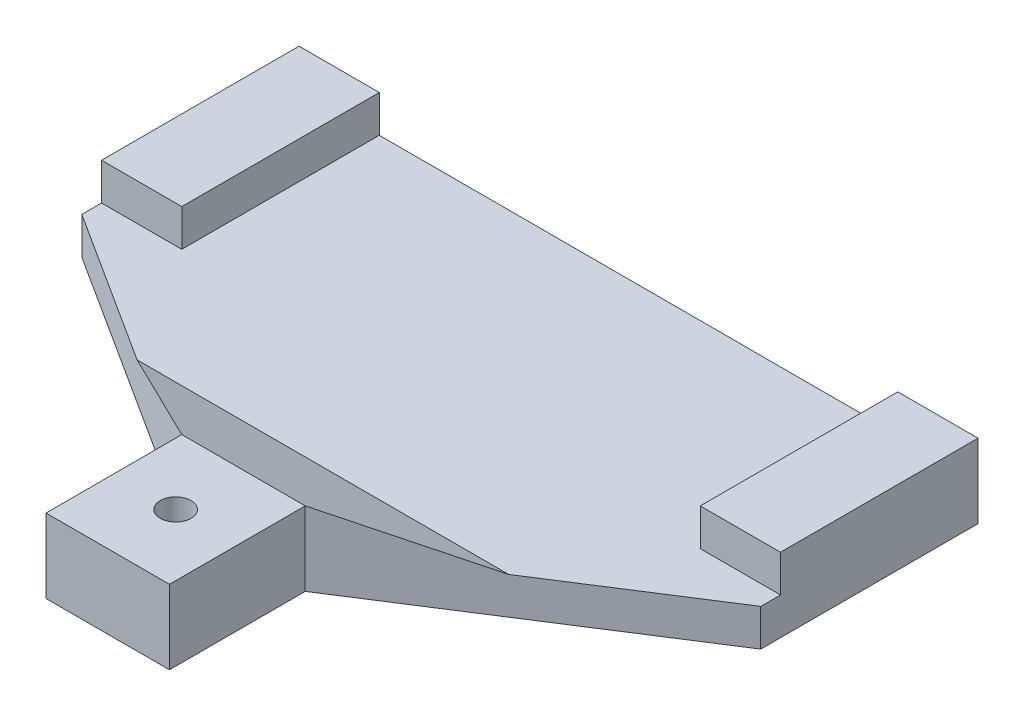
ISO-10303-21;
HEADER;
FILE_DESCRIPTION(('STEP AP214'),'2;1');
FILE_NAME('part.step','',(''),(''),'','','');
FILE_SCHEMA(('AUTOMOTIVE_DESIGN { 1 0 10303 214 1 1 1 1 }'));
ENDSEC;
DATA;
#1=APPLICATION_CONTEXT('core data for automotive mechanical design processes');
#2=APPLICATION_PROTOCOL_DEFINITION('international standard','automotive_design',2000,#1);
#3=PRODUCT_CONTEXT('',#1,'mechanical');
#4=PRODUCT('Part','Part','',(#3));
#5=PRODUCT_RELATED_PRODUCT_CATEGORY('part','',(#4));
#6=PRODUCT_DEFINITION_FORMATION('','',#4);
#7=PRODUCT_DEFINITION_CONTEXT('part definition',#1,'design');
#8=PRODUCT_DEFINITION('design','',#6,#7);
#9=PRODUCT_DEFINITION_SHAPE('','',#8);
#10=(LENGTH_UNIT() NAMED_UNIT(*) SI_UNIT(.MILLI.,.METRE.));
#11=(NAMED_UNIT(*) PLANE_ANGLE_UNIT() SI_UNIT($,.RADIAN.));
#12=(NAMED_UNIT(*) SI_UNIT($,.STERADIAN.) SOLID_ANGLE_UNIT());
#13=UNCERTAINTY_MEASURE_WITH_UNIT(LENGTH_MEASURE(1.E-05),#10,'distance_accuracy_value','');
#14=(GEOMETRIC_REPRESENTATION_CONTEXT(3) GLOBAL_UNCERTAINTY_ASSIGNED_CONTEXT((#13)) GLOBAL_UNIT_ASSIGNED_CONTEXT((#10,
#11,#12)) REPRESENTATION_CONTEXT('',''));
#15=CARTESIAN_POINT('',(0.,0.,0.));
#16=DIRECTION('',(0.,0.,1.));
#17=DIRECTION('',(1.,0.,0.));
#18=AXIS2_PLACEMENT_3D('',#15,#16,#17);
#19=CARTESIAN_POINT('',(0.,6.,60.));
#20=DIRECTION('',(0.,-1.,0.));
#21=DIRECTION('',(0.,0.,-1.));
#22=AXIS2_PLACEMENT_3D('',#19,#20,#21);
#23=PLANE('',#22);
#24=DIRECTION('',(-1.,0.,0.));
#25=VECTOR('',#24,1.);
#26=CARTESIAN_POINT('',(0.,6.,0.));
#27=LINE('',#26,#25);
#28=CARTESIAN_POINT('',(9.,6.,0.));
#29=VERTEX_POINT('',#28);
#30=CARTESIAN_POINT('',(2.5,6.,0.));
#31=VERTEX_POINT('',#30);
#32=EDGE_CURVE('E154',#29,#31,#27,.T.);
#33=ORIENTED_EDGE('',*,*,#32,.T.);
#34=DIRECTION('',(0.,0.,-1.));
#35=VECTOR('',#34,1.);
#36=CARTESIAN_POINT('',(2.5,6.,40.));
#37=LINE('',#36,#35);
#38=CARTESIAN_POINT('',(2.5,6.,16.));
#39=VERTEX_POINT('',#38);
#40=EDGE_CURVE('E137',#39,#31,#37,.T.);
#41=ORIENTED_EDGE('',*,*,#40,.F.);
#42=DIRECTION('',(-1.,0.,0.));
#43=VECTOR('',#42,1.);
#44=CARTESIAN_POINT('',(0.,6.,16.));
#45=LINE('',#44,#43);
#46=CARTESIAN_POINT('',(9.,6.,16.));
#47=VERTEX_POINT('',#46);
#48=EDGE_CURVE('E237',#47,#39,#45,.T.);
#49=ORIENTED_EDGE('',*,*,#48,.F.);
#50=DIRECTION('',(0.,0.,1.));
#51=VECTOR('',#50,1.);
#52=CARTESIAN_POINT('',(9.,6.,16.));
#53=LINE('',#52,#51);
#54=EDGE_CURVE('E160',#29,#47,#53,.T.);
#55=ORIENTED_EDGE('',*,*,#54,.F.);
#56=EDGE_LOOP('',(#33,#41,#49,#55));
#57=FACE_BOUND('',#56,.T.);
#58=ADVANCED_FACE('F33',(#57),#23,.F.);
#59=CARTESIAN_POINT('',(30.,6.,37.5));
#60=DIRECTION('',(0.,1.,0.));
#61=DIRECTION('',(0.,0.,1.));
#62=AXIS2_PLACEMENT_3D('',#59,#60,#61);
#63=CIRCLE('',#62,1.25);
#64=CARTESIAN_POINT('',(30.,6.,38.75));
#65=VERTEX_POINT('',#64);
#66=EDGE_CURVE('E256',#65,#65,#63,.T.);
#67=ORIENTED_EDGE('',*,*,#66,.F.);
#68=EDGE_LOOP('',(#67));
#69=FACE_BOUND('',#68,.T.);
#70=DIRECTION('',(0.,0.,1.));
#71=VECTOR('',#70,1.);
#72=CARTESIAN_POINT('',(25.,6.,32.));
#73=LINE('',#72,#71);
#74=CARTESIAN_POINT('',(25.,5.99999999999999,32.));
#75=VERTEX_POINT('',#74);
#76=CARTESIAN_POINT('',(25.,6.,43.));
#77=VERTEX_POINT('',#76);
#78=EDGE_CURVE('E216',#75,#77,#73,.T.);
#79=ORIENTED_EDGE('',*,*,#78,.T.);
#80=DIRECTION('',(1.,0.,0.));
#81=VECTOR('',#80,1.);
#82=CARTESIAN_POINT('',(25.,6.,43.));
#83=LINE('',#82,#81);
#84=CARTESIAN_POINT('',(35.,6.,43.));
#85=VERTEX_POINT('',#84);
#86=EDGE_CURVE('E219',#77,#85,#83,.T.);
#87=ORIENTED_EDGE('',*,*,#86,.T.);
#88=DIRECTION('',(0.,0.,-1.));
#89=VECTOR('',#88,1.);
#90=CARTESIAN_POINT('',(35.,6.,43.));
#91=LINE('',#90,#89);
#92=CARTESIAN_POINT('',(35.,6.,32.));
#93=VERTEX_POINT('',#92);
#94=EDGE_CURVE('E222',#85,#93,#91,.T.);
#95=ORIENTED_EDGE('',*,*,#94,.T.);
#96=DIRECTION('',(-1.,0.,0.));
#97=VECTOR('',#96,1.);
#98=CARTESIAN_POINT('',(35.,6.,32.));
#99=LINE('',#98,#97);
#100=EDGE_CURVE('E225',#93,#75,#99,.T.);
#101=ORIENTED_EDGE('',*,*,#100,.T.);
#102=EDGE_LOOP('',(#79,#87,#95,#101));
#103=FACE_BOUND('',#102,.T.);
#104=ADVANCED_FACE('F295',(#69,#103),#23,.F.);
#105=CARTESIAN_POINT('',(0.,0.,60.));
#106=DIRECTION('',(0.,1.,0.));
#107=DIRECTION('',(0.,0.,1.));
#108=AXIS2_PLACEMENT_3D('',#105,#106,#107);
#109=PLANE('',#108);
#110=CARTESIAN_POINT('',(30.,0.,37.5));
#111=DIRECTION('',(0.,1.,0.));
#112=DIRECTION('',(0.,0.,1.));
#113=AXIS2_PLACEMENT_3D('',#110,#111,#112);
#114=CIRCLE('',#113,1.25);
#115=CARTESIAN_POINT('',(30.,0.,38.75));
#116=VERTEX_POINT('',#115);
#117=EDGE_CURVE('E266',#116,#116,#114,.T.);
#118=ORIENTED_EDGE('',*,*,#117,.T.);
#119=EDGE_LOOP('',(#118));
#120=FACE_BOUND('',#119,.T.);
#121=DIRECTION('',(-0.842271400661512,0.,-0.539053696423367));
#122=VECTOR('',#121,1.);
#123=CARTESIAN_POINT('',(19.9772985244041,0.,28.7854710556186));
#124=LINE('',#123,#122);
#125=CARTESIAN_POINT('',(25.,0.,32.));
#126=VERTEX_POINT('',#125);
#127=CARTESIAN_POINT('',(2.5,0.,17.6));
#128=VERTEX_POINT('',#127);
#129=EDGE_CURVE('E213',#126,#128,#124,.T.);
#130=ORIENTED_EDGE('',*,*,#129,.T.);
#131=DIRECTION('',(0.,0.,-1.));
#132=VECTOR('',#131,1.);
#133=CARTESIAN_POINT('',(2.5,0.,40.));
#134=LINE('',#133,#132);
#135=CARTESIAN_POINT('',(2.5,0.,0.));
#136=VERTEX_POINT('',#135);
#137=EDGE_CURVE('E48',#128,#136,#134,.T.);
#138=ORIENTED_EDGE('',*,*,#137,.T.);
#139=DIRECTION('',(1.,0.,0.));
#140=VECTOR('',#139,1.);
#141=CARTESIAN_POINT('',(0.,0.,0.));
#142=LINE('',#141,#140);
#143=CARTESIAN_POINT('',(57.5,0.,0.));
#144=VERTEX_POINT('',#143);
#145=EDGE_CURVE('E156',#136,#144,#142,.T.);
#146=ORIENTED_EDGE('',*,*,#145,.T.);
#147=DIRECTION('',(0.,0.,-1.));
#148=VECTOR('',#147,1.);
#149=CARTESIAN_POINT('',(57.5,0.,40.));
#150=LINE('',#149,#148);
#151=CARTESIAN_POINT('',(57.5,0.,17.6));
#152=VERTEX_POINT('',#151);
#153=EDGE_CURVE('E328',#152,#144,#150,.T.);
#154=ORIENTED_EDGE('',*,*,#153,.F.);
#155=DIRECTION('',(-0.842271400661512,0.,0.539053696423367));
#156=VECTOR('',#155,1.);
#157=CARTESIAN_POINT('',(-2.54256526674234,0.,56.0272417707151));
#158=LINE('',#157,#156);
#159=CARTESIAN_POINT('',(35.,0.,32.));
#160=VERTEX_POINT('',#159);
#161=EDGE_CURVE('E180',#152,#160,#158,.T.);
#162=ORIENTED_EDGE('',*,*,#161,.T.);
#163=DIRECTION('',(0.,0.,1.));
#164=VECTOR('',#163,1.);
#165=CARTESIAN_POINT('',(35.,0.,60.));
#166=LINE('',#165,#164);
#167=CARTESIAN_POINT('',(35.,0.,43.));
#168=VERTEX_POINT('',#167);
#169=EDGE_CURVE('E204',#160,#168,#166,.T.);
#170=ORIENTED_EDGE('',*,*,#169,.T.);
#171=DIRECTION('',(-1.,0.,0.));
#172=VECTOR('',#171,1.);
#173=CARTESIAN_POINT('',(0.,0.,43.));
#174=LINE('',#173,#172);
#175=CARTESIAN_POINT('',(25.,0.,43.));
#176=VERTEX_POINT('',#175);
#177=EDGE_CURVE('E207',#168,#176,#174,.T.);
#178=ORIENTED_EDGE('',*,*,#177,.T.);
#179=DIRECTION('',(0.,0.,-1.));
#180=VECTOR('',#179,1.);
#181=CARTESIAN_POINT('',(25.,0.,60.));
#182=LINE('',#181,#180);
#183=EDGE_CURVE('E210',#176,#126,#182,.T.);
#184=ORIENTED_EDGE('',*,*,#183,.T.);
#185=EDGE_LOOP('',(#130,#138,#146,#154,#162,#170,#178,#184));
#186=FACE_BOUND('',#185,.T.);
#187=ADVANCED_FACE('F292',(#120,#186),#109,.F.);
#188=DIRECTION('',(-1.,0.,0.));
#189=VECTOR('',#188,1.);
#190=CARTESIAN_POINT('',(51.,6.,16.));
#191=LINE('',#190,#189);
#192=CARTESIAN_POINT('',(57.5,6.,16.));
#193=VERTEX_POINT('',#192);
#194=CARTESIAN_POINT('',(51.,6.,16.));
#195=VERTEX_POINT('',#194);
#196=EDGE_CURVE('E232',#193,#195,#191,.T.);
#197=ORIENTED_EDGE('',*,*,#196,.F.);
#198=DIRECTION('',(0.,0.,-1.));
#199=VECTOR('',#198,1.);
#200=CARTESIAN_POINT('',(57.5,6.,40.));
#201=LINE('',#200,#199);
#202=CARTESIAN_POINT('',(57.5,6.,0.));
#203=VERTEX_POINT('',#202);
#204=EDGE_CURVE('E329',#193,#203,#201,.T.);
#205=ORIENTED_EDGE('',*,*,#204,.T.);
#206=CARTESIAN_POINT('',(51.,6.,0.));
#207=VERTEX_POINT('',#206);
#208=EDGE_CURVE('E161',#203,#207,#27,.T.);
#209=ORIENTED_EDGE('',*,*,#208,.T.);
#210=DIRECTION('',(0.,0.,-1.));
#211=VECTOR('',#210,1.);
#212=CARTESIAN_POINT('',(51.,6.,0.));
#213=LINE('',#212,#211);
#214=EDGE_CURVE('E249',#195,#207,#213,.T.);
#215=ORIENTED_EDGE('',*,*,#214,.F.);
#216=EDGE_LOOP('',(#197,#205,#209,#215));
#217=FACE_BOUND('',#216,.T.);
#218=ADVANCED_FACE('F283',(#217),#23,.F.);
#219=CARTESIAN_POINT('',(0.,0.,0.));
#220=DIRECTION('',(0.,0.,-1.));
#221=DIRECTION('',(-1.,0.,0.));
#222=AXIS2_PLACEMENT_3D('',#219,#220,#221);
#223=PLANE('',#222);
#224=DIRECTION('',(0.,-1.,0.));
#225=VECTOR('',#224,1.);
#226=CARTESIAN_POINT('',(2.5,0.,0.));
#227=LINE('',#226,#225);
#228=EDGE_CURVE('E140',#31,#136,#227,.T.);
#229=ORIENTED_EDGE('',*,*,#228,.F.);
#230=ORIENTED_EDGE('',*,*,#32,.F.);
#231=DIRECTION('',(0.,1.,0.));
#232=VECTOR('',#231,1.);
#233=CARTESIAN_POINT('',(9.,3.,0.));
#234=LINE('',#233,#232);
#235=CARTESIAN_POINT('',(9.,3.,0.));
#236=VERTEX_POINT('',#235);
#237=EDGE_CURVE('E257',#236,#29,#234,.T.);
#238=ORIENTED_EDGE('',*,*,#237,.F.);
#239=DIRECTION('',(-1.,0.,0.));
#240=VECTOR('',#239,1.);
#241=CARTESIAN_POINT('',(9.,3.,0.));
#242=LINE('',#241,#240);
#243=CARTESIAN_POINT('',(51.,3.,0.));
#244=VERTEX_POINT('',#243);
#245=EDGE_CURVE('E239',#244,#236,#242,.T.);
#246=ORIENTED_EDGE('',*,*,#245,.F.);
#247=DIRECTION('',(0.,1.,0.));
#248=VECTOR('',#247,1.);
#249=CARTESIAN_POINT('',(51.,3.,0.));
#250=LINE('',#249,#248);
#251=EDGE_CURVE('E259',#244,#207,#250,.T.);
#252=ORIENTED_EDGE('',*,*,#251,.T.);
#253=ORIENTED_EDGE('',*,*,#208,.F.);
#254=DIRECTION('',(0.,1.,0.));
#255=VECTOR('',#254,1.);
#256=CARTESIAN_POINT('',(57.5,6.,0.));
#257=LINE('',#256,#255);
#258=EDGE_CURVE('E323',#144,#203,#257,.T.);
#259=ORIENTED_EDGE('',*,*,#258,.F.);
#260=ORIENTED_EDGE('',*,*,#145,.F.);
#261=EDGE_LOOP('',(#229,#230,#238,#246,#252,#253,#259,#260));
#262=FACE_BOUND('',#261,.T.);
#263=CARTESIAN_POINT('',(5.75,3.,0.));
#264=DIRECTION('',(0.,0.,-1.));
#265=DIRECTION('',(-1.,0.,0.));
#266=AXIS2_PLACEMENT_3D('',#263,#264,#265);
#267=CIRCLE('',#266,1.25);
#268=CARTESIAN_POINT('',(4.5,3.,0.));
#269=VERTEX_POINT('',#268);
#270=EDGE_CURVE('E269',#269,#269,#267,.T.);
#271=ORIENTED_EDGE('',*,*,#270,.F.);
#272=EDGE_LOOP('',(#271));
#273=FACE_BOUND('',#272,.T.);
#274=CARTESIAN_POINT('',(54.,3.,0.));
#275=DIRECTION('',(0.,0.,-1.));
#276=DIRECTION('',(-1.,0.,0.));
#277=AXIS2_PLACEMENT_3D('',#274,#275,#276);
#278=CIRCLE('',#277,1.25);
#279=CARTESIAN_POINT('',(52.75,3.,0.));
#280=VERTEX_POINT('',#279);
#281=EDGE_CURVE('E273',#280,#280,#278,.T.);
#282=ORIENTED_EDGE('',*,*,#281,.F.);
#283=EDGE_LOOP('',(#282));
#284=FACE_BOUND('',#283,.T.);
#285=ADVANCED_FACE('F151',(#262,#273,#284),#223,.T.);
#286=CARTESIAN_POINT('',(54.,3.,15.));
#287=DIRECTION('',(0.,0.,-1.));
#288=DIRECTION('',(-1.,0.,0.));
#289=AXIS2_PLACEMENT_3D('',#286,#287,#288);
#290=CYLINDRICAL_SURFACE('',#289,1.25);
#291=CARTESIAN_POINT('',(54.,3.,15.));
#292=DIRECTION('',(0.,0.,-1.));
#293=DIRECTION('',(-1.,0.,0.));
#294=AXIS2_PLACEMENT_3D('',#291,#292,#293);
#295=CIRCLE('',#294,1.25);
#296=CARTESIAN_POINT('',(52.75,3.,15.));
#297=VERTEX_POINT('',#296);
#298=EDGE_CURVE('E164',#297,#297,#295,.T.);
#299=ORIENTED_EDGE('',*,*,#298,.F.);
#300=EDGE_LOOP('',(#299));
#301=FACE_BOUND('',#300,.T.);
#302=ORIENTED_EDGE('',*,*,#281,.T.);
#303=EDGE_LOOP('',(#302));
#304=FACE_BOUND('',#303,.T.);
#305=ADVANCED_FACE('F280',(#301,#304),#290,.F.);
#306=CARTESIAN_POINT('',(54.,3.,15.));
#307=DIRECTION('',(0.,0.,-1.));
#308=DIRECTION('',(-1.,0.,0.));
#309=AXIS2_PLACEMENT_3D('',#306,#307,#308);
#310=PLANE('',#309);
#311=ORIENTED_EDGE('',*,*,#298,.T.);
#312=EDGE_LOOP('',(#311));
#313=FACE_BOUND('',#312,.T.);
#314=ADVANCED_FACE('F289',(#313),#310,.T.);
#315=CARTESIAN_POINT('',(5.75,3.,15.));
#316=DIRECTION('',(0.,0.,-1.));
#317=DIRECTION('',(-1.,0.,0.));
#318=AXIS2_PLACEMENT_3D('',#315,#316,#317);
#319=CYLINDRICAL_SURFACE('',#318,1.25);
#320=CARTESIAN_POINT('',(5.75,3.,15.));
#321=DIRECTION('',(0.,0.,-1.));
#322=DIRECTION('',(-1.,0.,0.));
#323=AXIS2_PLACEMENT_3D('',#320,#321,#322);
#324=CIRCLE('',#323,1.25);
#325=CARTESIAN_POINT('',(4.5,3.,15.));
#326=VERTEX_POINT('',#325);
#327=EDGE_CURVE('E270',#326,#326,#324,.T.);
#328=ORIENTED_EDGE('',*,*,#327,.F.);
#329=EDGE_LOOP('',(#328));
#330=FACE_BOUND('',#329,.T.);
#331=ORIENTED_EDGE('',*,*,#270,.T.);
#332=EDGE_LOOP('',(#331));
#333=FACE_BOUND('',#332,.T.);
#334=ADVANCED_FACE('F368',(#330,#333),#319,.F.);
#335=CARTESIAN_POINT('',(5.75,3.,15.));
#336=DIRECTION('',(0.,0.,-1.));
#337=DIRECTION('',(-1.,0.,0.));
#338=AXIS2_PLACEMENT_3D('',#335,#336,#337);
#339=PLANE('',#338);
#340=ORIENTED_EDGE('',*,*,#327,.T.);
#341=EDGE_LOOP('',(#340));
#342=FACE_BOUND('',#341,.T.);
#343=ADVANCED_FACE('F356',(#342),#339,.T.);
#344=CARTESIAN_POINT('',(30.,-9.,37.5));
#345=DIRECTION('',(0.,1.,0.));
#346=DIRECTION('',(0.,0.,1.));
#347=AXIS2_PLACEMENT_3D('',#344,#345,#346);
#348=CYLINDRICAL_SURFACE('',#347,1.25);
#349=ORIENTED_EDGE('',*,*,#66,.T.);
#350=EDGE_LOOP('',(#349));
#351=FACE_BOUND('',#350,.T.);
#352=ORIENTED_EDGE('',*,*,#117,.F.);
#353=EDGE_LOOP('',(#352));
#354=FACE_BOUND('',#353,.T.);
#355=ADVANCED_FACE('F349',(#351,#354),#348,.F.);
#356=CARTESIAN_POINT('',(0.,3.,16.));
#357=DIRECTION('',(0.,0.,-1.));
#358=DIRECTION('',(-1.,0.,0.));
#359=AXIS2_PLACEMENT_3D('',#356,#357,#358);
#360=PLANE('',#359);
#361=ORIENTED_EDGE('',*,*,#48,.T.);
#362=DIRECTION('',(0.,-1.,0.));
#363=VECTOR('',#362,1.);
#364=CARTESIAN_POINT('',(2.5,3.,16.));
#365=LINE('',#364,#363);
#366=CARTESIAN_POINT('',(2.5,3.,16.));
#367=VERTEX_POINT('',#366);
#368=EDGE_CURVE('E142',#39,#367,#365,.T.);
#369=ORIENTED_EDGE('',*,*,#368,.T.);
#370=DIRECTION('',(-1.,0.,0.));
#371=VECTOR('',#370,1.);
#372=CARTESIAN_POINT('',(0.,3.,16.));
#373=LINE('',#372,#371);
#374=CARTESIAN_POINT('',(9.,3.,16.));
#375=VERTEX_POINT('',#374);
#376=EDGE_CURVE('E245',#375,#367,#373,.T.);
#377=ORIENTED_EDGE('',*,*,#376,.F.);
#378=DIRECTION('',(0.,1.,0.));
#379=VECTOR('',#378,1.);
#380=CARTESIAN_POINT('',(9.,3.,16.));
#381=LINE('',#380,#379);
#382=EDGE_CURVE('E254',#375,#47,#381,.T.);
#383=ORIENTED_EDGE('',*,*,#382,.T.);
#384=EDGE_LOOP('',(#361,#369,#377,#383));
#385=FACE_BOUND('',#384,.T.);
#386=ADVANCED_FACE('F347',(#385),#360,.F.);
#387=CARTESIAN_POINT('',(9.,3.,16.));
#388=DIRECTION('',(-1.,0.,0.));
#389=DIRECTION('',(0.,0.,1.));
#390=AXIS2_PLACEMENT_3D('',#387,#388,#389);
#391=PLANE('',#390);
#392=ORIENTED_EDGE('',*,*,#54,.T.);
#393=ORIENTED_EDGE('',*,*,#382,.F.);
#394=DIRECTION('',(0.,0.,1.));
#395=VECTOR('',#394,1.);
#396=CARTESIAN_POINT('',(9.,3.,16.));
#397=LINE('',#396,#395);
#398=EDGE_CURVE('E242',#236,#375,#397,.T.);
#399=ORIENTED_EDGE('',*,*,#398,.F.);
#400=ORIENTED_EDGE('',*,*,#237,.T.);
#401=EDGE_LOOP('',(#392,#393,#399,#400));
#402=FACE_BOUND('',#401,.T.);
#403=ADVANCED_FACE('F345',(#402),#391,.F.);
#404=CARTESIAN_POINT('',(51.,3.,0.));
#405=DIRECTION('',(1.,0.,0.));
#406=DIRECTION('',(0.,0.,-1.));
#407=AXIS2_PLACEMENT_3D('',#404,#405,#406);
#408=PLANE('',#407);
#409=ORIENTED_EDGE('',*,*,#214,.T.);
#410=ORIENTED_EDGE('',*,*,#251,.F.);
#411=DIRECTION('',(0.,0.,-1.));
#412=VECTOR('',#411,1.);
#413=CARTESIAN_POINT('',(51.,3.,0.));
#414=LINE('',#413,#412);
#415=CARTESIAN_POINT('',(51.,3.,16.));
#416=VERTEX_POINT('',#415);
#417=EDGE_CURVE('E236',#416,#244,#414,.T.);
#418=ORIENTED_EDGE('',*,*,#417,.F.);
#419=DIRECTION('',(0.,1.,0.));
#420=VECTOR('',#419,1.);
#421=CARTESIAN_POINT('',(51.,3.,16.));
#422=LINE('',#421,#420);
#423=EDGE_CURVE('E247',#416,#195,#422,.T.);
#424=ORIENTED_EDGE('',*,*,#423,.T.);
#425=EDGE_LOOP('',(#409,#410,#418,#424));
#426=FACE_BOUND('',#425,.T.);
#427=ADVANCED_FACE('F339',(#426),#408,.F.);
#428=CARTESIAN_POINT('',(51.,3.,16.));
#429=DIRECTION('',(0.,0.,-1.));
#430=DIRECTION('',(-1.,0.,0.));
#431=AXIS2_PLACEMENT_3D('',#428,#429,#430);
#432=PLANE('',#431);
#433=DIRECTION('',(-1.,0.,0.));
#434=VECTOR('',#433,1.);
#435=CARTESIAN_POINT('',(51.,3.,16.));
#436=LINE('',#435,#434);
#437=CARTESIAN_POINT('',(57.5,3.,16.));
#438=VERTEX_POINT('',#437);
#439=EDGE_CURVE('E234',#438,#416,#436,.T.);
#440=ORIENTED_EDGE('',*,*,#439,.F.);
#441=DIRECTION('',(0.,1.,0.));
#442=VECTOR('',#441,1.);
#443=CARTESIAN_POINT('',(57.5,3.,16.));
#444=LINE('',#443,#442);
#445=EDGE_CURVE('E191',#438,#193,#444,.T.);
#446=ORIENTED_EDGE('',*,*,#445,.T.);
#447=ORIENTED_EDGE('',*,*,#196,.T.);
#448=ORIENTED_EDGE('',*,*,#423,.F.);
#449=EDGE_LOOP('',(#440,#446,#447,#448));
#450=FACE_BOUND('',#449,.T.);
#451=ADVANCED_FACE('F343',(#450),#432,.F.);
#452=CARTESIAN_POINT('',(0.,3.,0.));
#453=DIRECTION('',(0.,-1.,0.));
#454=DIRECTION('',(0.,0.,-1.));
#455=AXIS2_PLACEMENT_3D('',#452,#453,#454);
#456=PLANE('',#455);
#457=ORIENTED_EDGE('',*,*,#376,.T.);
#458=DIRECTION('',(0.,0.,1.));
#459=VECTOR('',#458,1.);
#460=CARTESIAN_POINT('',(2.5,3.,0.));
#461=LINE('',#460,#459);
#462=CARTESIAN_POINT('',(2.5,3.,17.6));
#463=VERTEX_POINT('',#462);
#464=EDGE_CURVE('E320',#367,#463,#461,.T.);
#465=ORIENTED_EDGE('',*,*,#464,.T.);
#466=DIRECTION('',(-0.842271400661512,0.,-0.539053696423367));
#467=VECTOR('',#466,1.);
#468=CARTESIAN_POINT('',(25.,3.,32.));
#469=LINE('',#468,#467);
#470=CARTESIAN_POINT('',(14.9476238101113,3.,25.5664792384712));
#471=VERTEX_POINT('',#470);
#472=EDGE_CURVE('E190',#471,#463,#469,.T.);
#473=ORIENTED_EDGE('',*,*,#472,.F.);
#474=DIRECTION('',(1.,0.,0.));
#475=VECTOR('',#474,1.);
#476=CARTESIAN_POINT('',(0.,3.,25.5664792384712));
#477=LINE('',#476,#475);
#478=CARTESIAN_POINT('',(45.0523761898887,3.,25.5664792384712));
#479=VERTEX_POINT('',#478);
#480=EDGE_CURVE('E163',#471,#479,#477,.T.);
#481=ORIENTED_EDGE('',*,*,#480,.T.);
#482=DIRECTION('',(-0.842271400661512,0.,0.539053696423367));
#483=VECTOR('',#482,1.);
#484=CARTESIAN_POINT('',(60.,3.,16.));
#485=LINE('',#484,#483);
#486=CARTESIAN_POINT('',(57.5,3.,17.6));
#487=VERTEX_POINT('',#486);
#488=EDGE_CURVE('E178',#487,#479,#485,.T.);
#489=ORIENTED_EDGE('',*,*,#488,.F.);
#490=DIRECTION('',(0.,0.,-1.));
#491=VECTOR('',#490,1.);
#492=CARTESIAN_POINT('',(57.5,3.,0.));
#493=LINE('',#492,#491);
#494=EDGE_CURVE('E55',#487,#438,#493,.T.);
#495=ORIENTED_EDGE('',*,*,#494,.T.);
#496=ORIENTED_EDGE('',*,*,#439,.T.);
#497=ORIENTED_EDGE('',*,*,#417,.T.);
#498=ORIENTED_EDGE('',*,*,#245,.T.);
#499=ORIENTED_EDGE('',*,*,#398,.T.);
#500=EDGE_LOOP('',(#457,#465,#473,#481,#489,#495,#496,#497,#498,#499));
#501=FACE_BOUND('',#500,.T.);
#502=ADVANCED_FACE('F185',(#501),#456,.F.);
#503=CARTESIAN_POINT('',(25.,3.,32.));
#504=DIRECTION('',(-1.,0.,0.));
#505=DIRECTION('',(0.,0.,1.));
#506=AXIS2_PLACEMENT_3D('',#503,#504,#505);
#507=PLANE('',#506);
#508=ORIENTED_EDGE('',*,*,#78,.F.);
#509=DIRECTION('',(0.,1.,0.));
#510=VECTOR('',#509,1.);
#511=CARTESIAN_POINT('',(25.,-49.,32.));
#512=LINE('',#511,#510);
#513=EDGE_CURVE('E200',#126,#75,#512,.T.);
#514=ORIENTED_EDGE('',*,*,#513,.F.);
#515=ORIENTED_EDGE('',*,*,#183,.F.);
#516=DIRECTION('',(0.,1.,0.));
#517=VECTOR('',#516,1.);
#518=CARTESIAN_POINT('',(25.,3.,43.));
#519=LINE('',#518,#517);
#520=EDGE_CURVE('E228',#176,#77,#519,.T.);
#521=ORIENTED_EDGE('',*,*,#520,.T.);
#522=EDGE_LOOP('',(#508,#514,#515,#521));
#523=FACE_BOUND('',#522,.T.);
#524=ADVANCED_FACE('F314',(#523),#507,.T.);
#525=CARTESIAN_POINT('',(35.,3.,43.));
#526=DIRECTION('',(1.,0.,0.));
#527=DIRECTION('',(0.,0.,-1.));
#528=AXIS2_PLACEMENT_3D('',#525,#526,#527);
#529=PLANE('',#528);
#530=ORIENTED_EDGE('',*,*,#94,.F.);
#531=DIRECTION('',(0.,1.,0.));
#532=VECTOR('',#531,1.);
#533=CARTESIAN_POINT('',(35.,3.,43.));
#534=LINE('',#533,#532);
#535=EDGE_CURVE('E229',#168,#85,#534,.T.);
#536=ORIENTED_EDGE('',*,*,#535,.F.);
#537=ORIENTED_EDGE('',*,*,#169,.F.);
#538=DIRECTION('',(0.,1.,0.));
#539=VECTOR('',#538,1.);
#540=CARTESIAN_POINT('',(35.,-49.,32.));
#541=LINE('',#540,#539);
#542=EDGE_CURVE('E194',#160,#93,#541,.T.);
#543=ORIENTED_EDGE('',*,*,#542,.T.);
#544=EDGE_LOOP('',(#530,#536,#537,#543));
#545=FACE_BOUND('',#544,.T.);
#546=ADVANCED_FACE('F417',(#545),#529,.T.);
#547=CARTESIAN_POINT('',(25.,3.,43.));
#548=DIRECTION('',(0.,0.,1.));
#549=DIRECTION('',(1.,0.,0.));
#550=AXIS2_PLACEMENT_3D('',#547,#548,#549);
#551=PLANE('',#550);
#552=ORIENTED_EDGE('',*,*,#86,.F.);
#553=ORIENTED_EDGE('',*,*,#520,.F.);
#554=ORIENTED_EDGE('',*,*,#177,.F.);
#555=ORIENTED_EDGE('',*,*,#535,.T.);
#556=EDGE_LOOP('',(#552,#553,#554,#555));
#557=FACE_BOUND('',#556,.T.);
#558=ADVANCED_FACE('F412',(#557),#551,.T.);
#559=CARTESIAN_POINT('',(25.,-49.,32.));
#560=DIRECTION('',(0.539053696423367,0.,-0.842271400661512));
#561=DIRECTION('',(-0.842271400661512,0.,-0.539053696423367));
#562=AXIS2_PLACEMENT_3D('',#559,#560,#561);
#563=PLANE('',#562);
#564=ORIENTED_EDGE('',*,*,#472,.T.);
#565=DIRECTION('',(0.,-1.,0.));
#566=VECTOR('',#565,1.);
#567=CARTESIAN_POINT('',(2.5,-49.,17.6));
#568=LINE('',#567,#566);
#569=EDGE_CURVE('E11',#463,#128,#568,.T.);
#570=ORIENTED_EDGE('',*,*,#569,.T.);
#571=ORIENTED_EDGE('',*,*,#129,.F.);
#572=ORIENTED_EDGE('',*,*,#513,.T.);
#573=DIRECTION('',(-0.816860277986021,-0.243781250091197,-0.522790577911053));
#574=VECTOR('',#573,1.);
#575=CARTESIAN_POINT('',(14.0475629155499,2.73138861571853,24.9904402659519));
#576=LINE('',#575,#574);
#577=EDGE_CURVE('E170',#75,#471,#576,.T.);
#578=ORIENTED_EDGE('',*,*,#577,.T.);
#579=EDGE_LOOP('',(#564,#570,#571,#572,#578));
#580=FACE_BOUND('',#579,.T.);
#581=ADVANCED_FACE('F310',(#580),#563,.F.);
#582=CARTESIAN_POINT('',(60.,-49.,16.));
#583=DIRECTION('',(-0.539053696423367,0.,-0.842271400661512));
#584=DIRECTION('',(-0.842271400661512,0.,0.539053696423367));
#585=AXIS2_PLACEMENT_3D('',#582,#583,#584);
#586=PLANE('',#585);
#587=ORIENTED_EDGE('',*,*,#161,.F.);
#588=DIRECTION('',(0.,1.,0.));
#589=VECTOR('',#588,1.);
#590=CARTESIAN_POINT('',(57.5,-49.,17.6));
#591=LINE('',#590,#589);
#592=EDGE_CURVE('E41',#152,#487,#591,.T.);
#593=ORIENTED_EDGE('',*,*,#592,.T.);
#594=ORIENTED_EDGE('',*,*,#488,.T.);
#595=DIRECTION('',(-0.816860277986021,0.243781250091197,0.522790577911053));
#596=VECTOR('',#595,1.);
#597=CARTESIAN_POINT('',(69.4667046370494,-4.28613652711823,9.94130903228836));
#598=LINE('',#597,#596);
#599=EDGE_CURVE('E172',#479,#93,#598,.T.);
#600=ORIENTED_EDGE('',*,*,#599,.T.);
#601=ORIENTED_EDGE('',*,*,#542,.F.);
#602=EDGE_LOOP('',(#587,#593,#594,#600,#601));
#603=FACE_BOUND('',#602,.T.);
#604=ADVANCED_FACE('F177',(#603),#586,.F.);
#605=CARTESIAN_POINT('',(35.,5.99999999999999,32.));
#606=DIRECTION('',(0.,-0.906307787036653,0.422618261740692));
#607=DIRECTION('',(-1.,0.,0.));
#608=AXIS2_PLACEMENT_3D('',#605,#606,#607);
#609=PLANE('',#608);
#610=ORIENTED_EDGE('',*,*,#599,.F.);
#611=ORIENTED_EDGE('',*,*,#480,.F.);
#612=ORIENTED_EDGE('',*,*,#577,.F.);
#613=ORIENTED_EDGE('',*,*,#100,.F.);
#614=EDGE_LOOP('',(#610,#611,#612,#613));
#615=FACE_BOUND('',#614,.T.);
#616=ADVANCED_FACE('F35',(#615),#609,.F.);
#617=CARTESIAN_POINT('',(57.5,6.,40.));
#618=DIRECTION('',(-1.,0.,0.));
#619=DIRECTION('',(0.,0.,1.));
#620=AXIS2_PLACEMENT_3D('',#617,#618,#619);
#621=PLANE('',#620);
#622=ORIENTED_EDGE('',*,*,#494,.F.);
#623=ORIENTED_EDGE('',*,*,#592,.F.);
#624=ORIENTED_EDGE('',*,*,#153,.T.);
#625=ORIENTED_EDGE('',*,*,#258,.T.);
#626=ORIENTED_EDGE('',*,*,#204,.F.);
#627=ORIENTED_EDGE('',*,*,#445,.F.);
#628=EDGE_LOOP('',(#622,#623,#624,#625,#626,#627));
#629=FACE_BOUND('',#628,.T.);
#630=ADVANCED_FACE('F332',(#629),#621,.F.);
#631=CARTESIAN_POINT('',(2.5,0.,40.));
#632=DIRECTION('',(1.,0.,0.));
#633=DIRECTION('',(0.,0.,-1.));
#634=AXIS2_PLACEMENT_3D('',#631,#632,#633);
#635=PLANE('',#634);
#636=ORIENTED_EDGE('',*,*,#40,.T.);
#637=ORIENTED_EDGE('',*,*,#228,.T.);
#638=ORIENTED_EDGE('',*,*,#137,.F.);
#639=ORIENTED_EDGE('',*,*,#569,.F.);
#640=ORIENTED_EDGE('',*,*,#464,.F.);
#641=ORIENTED_EDGE('',*,*,#368,.F.);
#642=EDGE_LOOP('',(#636,#637,#638,#639,#640,#641));
#643=FACE_BOUND('',#642,.T.);
#644=ADVANCED_FACE('F139',(#643),#635,.F.);
#645=CLOSED_SHELL('',(#58,#104,#187,#218,#285,#305,#314,#334,#343,#355,#386,#403,#427,#451,#502,
#524,#546,#558,#581,#604,#616,#630,#644));
#646=MANIFOLD_SOLID_BREP('B2',#645);
#647=ADVANCED_BREP_SHAPE_REPRESENTATION('',(#18,#646),#14);
#648=SHAPE_DEFINITION_REPRESENTATION(#9,#647);
ENDSEC;
END-ISO-10303-21;
